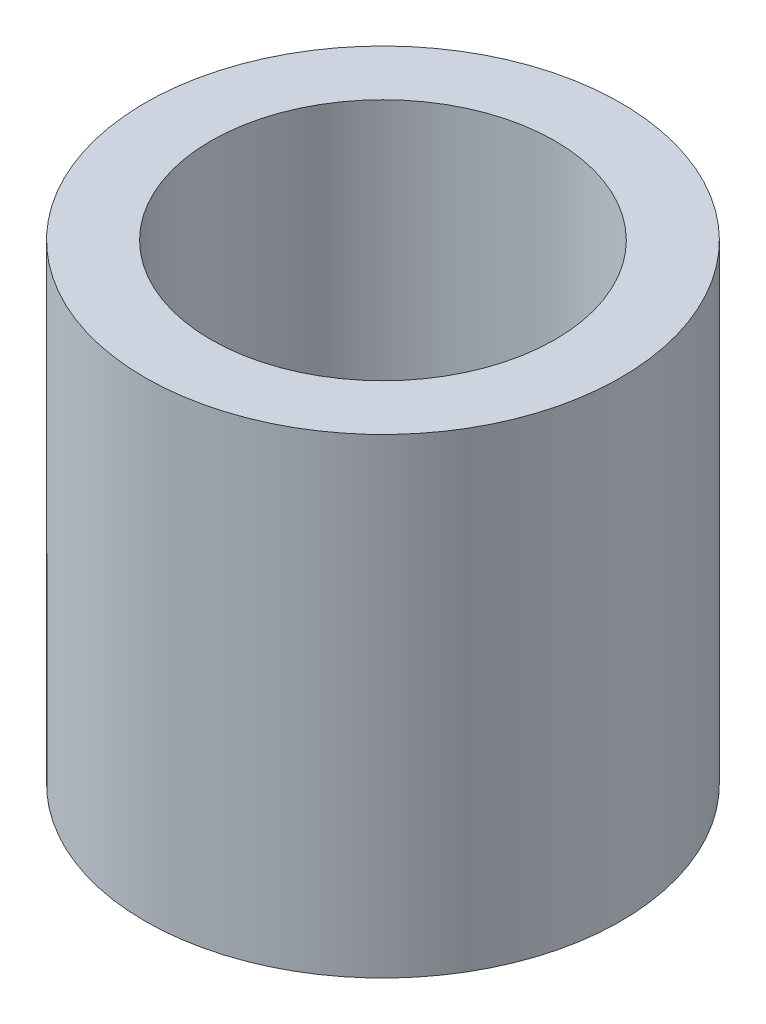
ISO-10303-21;
HEADER;
FILE_DESCRIPTION(('STEP AP214'),'2;1');
FILE_NAME('part.step','',(''),(''),'','','');
FILE_SCHEMA(('AUTOMOTIVE_DESIGN { 1 0 10303 214 1 1 1 1 }'));
ENDSEC;
DATA;
#1=APPLICATION_CONTEXT('core data for automotive mechanical design processes');
#2=APPLICATION_PROTOCOL_DEFINITION('international standard','automotive_design',2000,#1);
#3=PRODUCT_CONTEXT('',#1,'mechanical');
#4=PRODUCT('Part','Part','',(#3));
#5=PRODUCT_RELATED_PRODUCT_CATEGORY('part','',(#4));
#6=PRODUCT_DEFINITION_FORMATION('','',#4);
#7=PRODUCT_DEFINITION_CONTEXT('part definition',#1,'design');
#8=PRODUCT_DEFINITION('design','',#6,#7);
#9=PRODUCT_DEFINITION_SHAPE('','',#8);
#10=(LENGTH_UNIT() NAMED_UNIT(*) SI_UNIT(.MILLI.,.METRE.));
#11=(NAMED_UNIT(*) PLANE_ANGLE_UNIT() SI_UNIT($,.RADIAN.));
#12=(NAMED_UNIT(*) SI_UNIT($,.STERADIAN.) SOLID_ANGLE_UNIT());
#13=UNCERTAINTY_MEASURE_WITH_UNIT(LENGTH_MEASURE(1.E-05),#10,'distance_accuracy_value','');
#14=(GEOMETRIC_REPRESENTATION_CONTEXT(3) GLOBAL_UNCERTAINTY_ASSIGNED_CONTEXT((#13)) GLOBAL_UNIT_ASSIGNED_CONTEXT((#10,
#11,#12)) REPRESENTATION_CONTEXT('',''));
#15=CARTESIAN_POINT('',(0.,0.,0.));
#16=DIRECTION('',(0.,0.,1.));
#17=DIRECTION('',(1.,0.,0.));
#18=AXIS2_PLACEMENT_3D('',#15,#16,#17);
#19=CARTESIAN_POINT('',(0.,4.65,0.));
#20=DIRECTION('',(0.,1.,0.));
#21=DIRECTION('',(0.,0.,1.));
#22=AXIS2_PLACEMENT_3D('',#19,#20,#21);
#23=PLANE('',#22);
#24=CARTESIAN_POINT('',(0.,4.65,0.));
#25=DIRECTION('',(0.,1.,0.));
#26=DIRECTION('',(0.,0.,1.));
#27=AXIS2_PLACEMENT_3D('',#24,#25,#26);
#28=CIRCLE('',#27,2.35);
#29=CARTESIAN_POINT('',(0.,4.65,2.35));
#30=VERTEX_POINT('',#29);
#31=EDGE_CURVE('E10',#30,#30,#28,.T.);
#32=ORIENTED_EDGE('',*,*,#31,.T.);
#33=EDGE_LOOP('',(#32));
#34=FACE_BOUND('',#33,.T.);
#35=CARTESIAN_POINT('',(0.,4.65,0.));
#36=DIRECTION('',(0.,1.,0.));
#37=DIRECTION('',(0.,0.,1.));
#38=AXIS2_PLACEMENT_3D('',#35,#36,#37);
#39=CIRCLE('',#38,1.7);
#40=CARTESIAN_POINT('',(0.,4.65,1.7));
#41=VERTEX_POINT('',#40);
#42=EDGE_CURVE('E41',#41,#41,#39,.T.);
#43=ORIENTED_EDGE('',*,*,#42,.F.);
#44=EDGE_LOOP('',(#43));
#45=FACE_BOUND('',#44,.T.);
#46=ADVANCED_FACE('F30',(#34,#45),#23,.T.);
#47=CARTESIAN_POINT('',(0.,0.,0.));
#48=DIRECTION('',(0.,1.,0.));
#49=DIRECTION('',(0.,0.,1.));
#50=AXIS2_PLACEMENT_3D('',#47,#48,#49);
#51=PLANE('',#50);
#52=CARTESIAN_POINT('',(0.,0.,0.));
#53=DIRECTION('',(0.,1.,0.));
#54=DIRECTION('',(0.,0.,1.));
#55=AXIS2_PLACEMENT_3D('',#52,#53,#54);
#56=CIRCLE('',#55,2.35);
#57=CARTESIAN_POINT('',(0.,0.,2.35));
#58=VERTEX_POINT('',#57);
#59=EDGE_CURVE('E34',#58,#58,#56,.T.);
#60=ORIENTED_EDGE('',*,*,#59,.F.);
#61=EDGE_LOOP('',(#60));
#62=FACE_BOUND('',#61,.T.);
#63=CARTESIAN_POINT('',(0.,0.,0.));
#64=DIRECTION('',(0.,1.,0.));
#65=DIRECTION('',(0.,0.,1.));
#66=AXIS2_PLACEMENT_3D('',#63,#64,#65);
#67=CIRCLE('',#66,1.7);
#68=CARTESIAN_POINT('',(0.,0.,1.7));
#69=VERTEX_POINT('',#68);
#70=EDGE_CURVE('E43',#69,#69,#67,.T.);
#71=ORIENTED_EDGE('',*,*,#70,.T.);
#72=EDGE_LOOP('',(#71));
#73=FACE_BOUND('',#72,.T.);
#74=ADVANCED_FACE('F53',(#62,#73),#51,.F.);
#75=CARTESIAN_POINT('',(0.,4.65,0.));
#76=DIRECTION('',(0.,-1.,0.));
#77=DIRECTION('',(0.,0.,-1.));
#78=AXIS2_PLACEMENT_3D('',#75,#76,#77);
#79=CYLINDRICAL_SURFACE('',#78,2.35);
#80=ORIENTED_EDGE('',*,*,#31,.F.);
#81=EDGE_LOOP('',(#80));
#82=FACE_BOUND('',#81,.T.);
#83=ORIENTED_EDGE('',*,*,#59,.T.);
#84=EDGE_LOOP('',(#83));
#85=FACE_BOUND('',#84,.T.);
#86=ADVANCED_FACE('F32',(#82,#85),#79,.T.);
#87=CARTESIAN_POINT('',(0.,4.65,0.));
#88=DIRECTION('',(0.,-1.,0.));
#89=DIRECTION('',(0.,0.,-1.));
#90=AXIS2_PLACEMENT_3D('',#87,#88,#89);
#91=CYLINDRICAL_SURFACE('',#90,1.7);
#92=ORIENTED_EDGE('',*,*,#42,.T.);
#93=EDGE_LOOP('',(#92));
#94=FACE_BOUND('',#93,.T.);
#95=ORIENTED_EDGE('',*,*,#70,.F.);
#96=EDGE_LOOP('',(#95));
#97=FACE_BOUND('',#96,.T.);
#98=ADVANCED_FACE('F49',(#94,#97),#91,.F.);
#99=CLOSED_SHELL('',(#46,#74,#86,#98));
#100=MANIFOLD_SOLID_BREP('B2',#99);
#101=ADVANCED_BREP_SHAPE_REPRESENTATION('',(#18,#100),#14);
#102=SHAPE_DEFINITION_REPRESENTATION(#9,#101);
ENDSEC;
END-ISO-10303-21;
